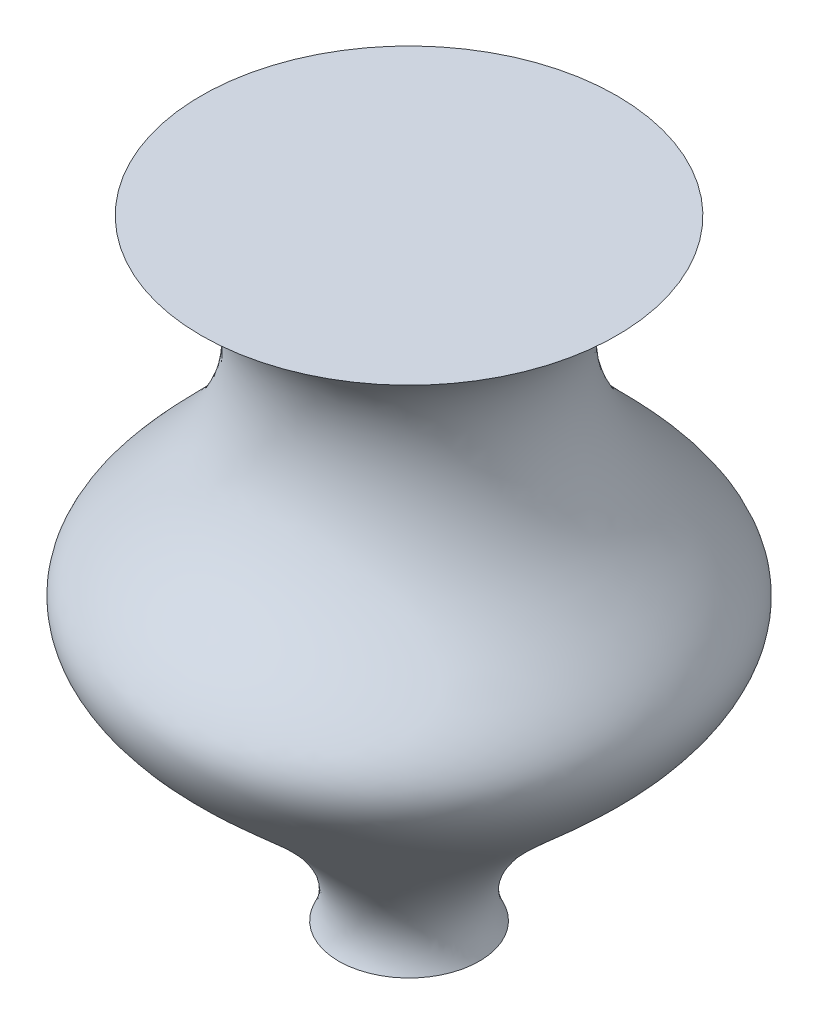
ISO-10303-21;
HEADER;
FILE_DESCRIPTION(('STEP AP214'),'2;1');
FILE_NAME('part.step','',(''),(''),'','','');
FILE_SCHEMA(('AUTOMOTIVE_DESIGN { 1 0 10303 214 1 1 1 1 }'));
ENDSEC;
DATA;
#1=APPLICATION_CONTEXT('core data for automotive mechanical design processes');
#2=APPLICATION_PROTOCOL_DEFINITION('international standard','automotive_design',2000,#1);
#3=PRODUCT_CONTEXT('',#1,'mechanical');
#4=PRODUCT('Part','Part','',(#3));
#5=PRODUCT_RELATED_PRODUCT_CATEGORY('part','',(#4));
#6=PRODUCT_DEFINITION_FORMATION('','',#4);
#7=PRODUCT_DEFINITION_CONTEXT('part definition',#1,'design');
#8=PRODUCT_DEFINITION('design','',#6,#7);
#9=PRODUCT_DEFINITION_SHAPE('','',#8);
#10=(LENGTH_UNIT() NAMED_UNIT(*) SI_UNIT(.MILLI.,.METRE.));
#11=(NAMED_UNIT(*) PLANE_ANGLE_UNIT() SI_UNIT($,.RADIAN.));
#12=(NAMED_UNIT(*) SI_UNIT($,.STERADIAN.) SOLID_ANGLE_UNIT());
#13=UNCERTAINTY_MEASURE_WITH_UNIT(LENGTH_MEASURE(1.E-05),#10,'distance_accuracy_value','');
#14=(GEOMETRIC_REPRESENTATION_CONTEXT(3) GLOBAL_UNCERTAINTY_ASSIGNED_CONTEXT((#13)) GLOBAL_UNIT_ASSIGNED_CONTEXT((#10,
#11,#12)) REPRESENTATION_CONTEXT('',''));
#15=CARTESIAN_POINT('',(0.,0.,0.));
#16=DIRECTION('',(0.,0.,1.));
#17=DIRECTION('',(1.,0.,0.));
#18=AXIS2_PLACEMENT_3D('',#15,#16,#17);
#19=CARTESIAN_POINT('',(-4.44311237359001,15.6273552471509,0.));
#20=CARTESIAN_POINT('',(-2.97016242751375,15.036541419586,0.));
#21=CARTESIAN_POINT('',(-2.87166314887408,12.4138835289901,0.));
#22=CARTESIAN_POINT('',(-7.16610180738216,9.64104397261335,0.));
#23=CARTESIAN_POINT('',(-1.34241122488196,7.19981491558275,0.));
#24=CARTESIAN_POINT('',(-2.19180347306645,5.62735524715089,0.));
#25=B_SPLINE_CURVE_WITH_KNOTS('',3,(#19,#20,#21,#22,#23,#24),.UNSPECIFIED.,.F.,.F.,(4,1,1,4),
(0.,0.328646361816444,0.529079029671267,1.),.UNSPECIFIED.);
#26=CARTESIAN_POINT('',(-1.03997101233347,15.6273552471509,0.));
#27=DIRECTION('',(0.,1.,0.));
#28=AXIS1_PLACEMENT('',#26,#27);
#29=SURFACE_OF_REVOLUTION('',#25,#28);
#30=CARTESIAN_POINT('',(-1.03997101233347,5.62735524715089,0.));
#31=DIRECTION('',(0.,1.,0.));
#32=DIRECTION('',(0.,0.,1.));
#33=AXIS2_PLACEMENT_3D('',#30,#31,#32);
#34=CIRCLE('',#33,1.15183246073299);
#35=CARTESIAN_POINT('',(-1.03997101233347,5.62735524715089,1.15183246073299));
#36=VERTEX_POINT('',#35);
#37=EDGE_CURVE('E10',#36,#36,#34,.T.);
#38=ORIENTED_EDGE('',*,*,#37,.T.);
#39=EDGE_LOOP('',(#38));
#40=FACE_BOUND('',#39,.T.);
#41=CARTESIAN_POINT('',(-1.03997101233347,15.6273552471509,0.));
#42=DIRECTION('',(0.,1.,0.));
#43=DIRECTION('',(0.,0.,1.));
#44=AXIS2_PLACEMENT_3D('',#41,#42,#43);
#45=CIRCLE('',#44,3.40314136125654);
#46=CARTESIAN_POINT('',(-1.03997101233347,15.6273552471509,3.40314136125654));
#47=VERTEX_POINT('',#46);
#48=EDGE_CURVE('E40',#47,#47,#45,.T.);
#49=ORIENTED_EDGE('',*,*,#48,.F.);
#50=EDGE_LOOP('',(#49));
#51=FACE_BOUND('',#50,.T.);
#52=ADVANCED_FACE('F33',(#40,#51),#29,.F.);
#53=CARTESIAN_POINT('',(-1.03997101233347,5.62735524715089,0.));
#54=DIRECTION('',(0.,-1.,0.));
#55=DIRECTION('',(0.,0.,-1.));
#56=AXIS2_PLACEMENT_3D('',#53,#54,#55);
#57=PLANE('',#56);
#58=ORIENTED_EDGE('',*,*,#37,.F.);
#59=EDGE_LOOP('',(#58));
#60=FACE_BOUND('',#59,.T.);
#61=ADVANCED_FACE('F55',(#60),#57,.T.);
#62=CARTESIAN_POINT('',(-4.44311237359001,15.6273552471509,0.));
#63=DIRECTION('',(0.,1.,0.));
#64=DIRECTION('',(0.,0.,1.));
#65=AXIS2_PLACEMENT_3D('',#62,#63,#64);
#66=PLANE('',#65);
#67=ORIENTED_EDGE('',*,*,#48,.T.);
#68=EDGE_LOOP('',(#67));
#69=FACE_BOUND('',#68,.T.);
#70=ADVANCED_FACE('F52',(#69),#66,.T.);
#71=CLOSED_SHELL('',(#52,#61,#70));
#72=MANIFOLD_SOLID_BREP('B2',#71);
#73=ADVANCED_BREP_SHAPE_REPRESENTATION('',(#18,#72),#14);
#74=SHAPE_DEFINITION_REPRESENTATION(#9,#73);
ENDSEC;
END-ISO-10303-21;
